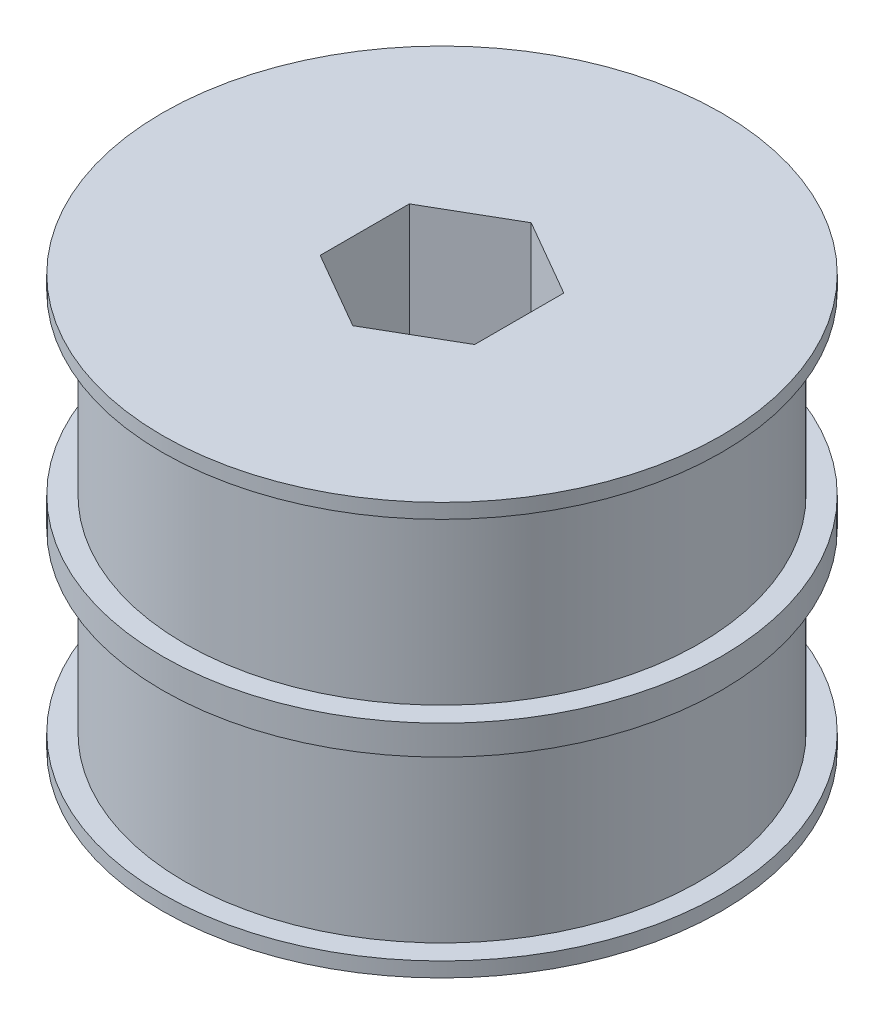
ISO-10303-21;
HEADER;
FILE_DESCRIPTION(('STEP AP214'),'2;1');
FILE_NAME('part.step','',(''),(''),'','','');
FILE_SCHEMA(('AUTOMOTIVE_DESIGN { 1 0 10303 214 1 1 1 1 }'));
ENDSEC;
DATA;
#1=APPLICATION_CONTEXT('core data for automotive mechanical design processes');
#2=APPLICATION_PROTOCOL_DEFINITION('international standard','automotive_design',2000,#1);
#3=PRODUCT_CONTEXT('',#1,'mechanical');
#4=PRODUCT('Part','Part','',(#3));
#5=PRODUCT_RELATED_PRODUCT_CATEGORY('part','',(#4));
#6=PRODUCT_DEFINITION_FORMATION('','',#4);
#7=PRODUCT_DEFINITION_CONTEXT('part definition',#1,'design');
#8=PRODUCT_DEFINITION('design','',#6,#7);
#9=PRODUCT_DEFINITION_SHAPE('','',#8);
#10=(LENGTH_UNIT() NAMED_UNIT(*) SI_UNIT(.MILLI.,.METRE.));
#11=(NAMED_UNIT(*) PLANE_ANGLE_UNIT() SI_UNIT($,.RADIAN.));
#12=(NAMED_UNIT(*) SI_UNIT($,.STERADIAN.) SOLID_ANGLE_UNIT());
#13=UNCERTAINTY_MEASURE_WITH_UNIT(LENGTH_MEASURE(1.E-05),#10,'distance_accuracy_value','');
#14=(GEOMETRIC_REPRESENTATION_CONTEXT(3) GLOBAL_UNCERTAINTY_ASSIGNED_CONTEXT((#13)) GLOBAL_UNIT_ASSIGNED_CONTEXT((#10,
#11,#12)) REPRESENTATION_CONTEXT('',''));
#15=CARTESIAN_POINT('',(0.,0.,0.));
#16=DIRECTION('',(0.,0.,1.));
#17=DIRECTION('',(1.,0.,0.));
#18=AXIS2_PLACEMENT_3D('',#15,#16,#17);
#19=CARTESIAN_POINT('',(0.,17.78,0.));
#20=DIRECTION('',(0.,-1.,0.));
#21=DIRECTION('',(0.,0.,-1.));
#22=AXIS2_PLACEMENT_3D('',#19,#20,#21);
#23=CYLINDRICAL_SURFACE('',#22,24.13);
#24=CARTESIAN_POINT('',(0.,17.78,0.));
#25=DIRECTION('',(0.,1.,0.));
#26=DIRECTION('',(0.,0.,1.));
#27=AXIS2_PLACEMENT_3D('',#24,#25,#26);
#28=CIRCLE('',#27,24.13);
#29=CARTESIAN_POINT('',(0.,17.78,24.13));
#30=VERTEX_POINT('',#29);
#31=EDGE_CURVE('E123',#30,#30,#28,.T.);
#32=ORIENTED_EDGE('',*,*,#31,.F.);
#33=EDGE_LOOP('',(#32));
#34=FACE_BOUND('',#33,.T.);
#35=CARTESIAN_POINT('',(0.,16.51,0.));
#36=DIRECTION('',(0.,-1.,0.));
#37=DIRECTION('',(0.,0.,-1.));
#38=AXIS2_PLACEMENT_3D('',#35,#36,#37);
#39=CIRCLE('',#38,24.13);
#40=CARTESIAN_POINT('',(0.,16.51,-24.13));
#41=VERTEX_POINT('',#40);
#42=EDGE_CURVE('E157',#41,#41,#39,.T.);
#43=ORIENTED_EDGE('',*,*,#42,.F.);
#44=EDGE_LOOP('',(#43));
#45=FACE_BOUND('',#44,.T.);
#46=ADVANCED_FACE('F41',(#34,#45),#23,.T.);
#47=CARTESIAN_POINT('',(3.33375,17.78,-5.77422437973275));
#48=DIRECTION('',(-0.5,0.,0.866025403784439));
#49=DIRECTION('',(0.866025403784439,0.,0.5));
#50=AXIS2_PLACEMENT_3D('',#47,#48,#49);
#51=PLANE('',#50);
#52=DIRECTION('',(-0.866025403784439,0.,-0.5));
#53=VECTOR('',#52,1.);
#54=CARTESIAN_POINT('',(3.33375,-17.78,-5.77422437973275));
#55=LINE('',#54,#53);
#56=CARTESIAN_POINT('',(6.6675,-17.78,-3.84948291982183));
#57=VERTEX_POINT('',#56);
#58=CARTESIAN_POINT('',(0.,-17.78,-7.69896583964366));
#59=VERTEX_POINT('',#58);
#60=EDGE_CURVE('E129',#57,#59,#55,.T.);
#61=ORIENTED_EDGE('',*,*,#60,.F.);
#62=DIRECTION('',(0.,-1.,0.));
#63=VECTOR('',#62,1.);
#64=CARTESIAN_POINT('',(6.6675,17.78,-3.84948291982183));
#65=LINE('',#64,#63);
#66=CARTESIAN_POINT('',(6.6675,17.78,-3.84948291982183));
#67=VERTEX_POINT('',#66);
#68=EDGE_CURVE('E11',#67,#57,#65,.T.);
#69=ORIENTED_EDGE('',*,*,#68,.F.);
#70=DIRECTION('',(-0.866025403784439,0.,-0.5));
#71=VECTOR('',#70,1.);
#72=CARTESIAN_POINT('',(3.33375,17.78,-5.77422437973275));
#73=LINE('',#72,#71);
#74=CARTESIAN_POINT('',(0.,17.78,-7.69896583964366));
#75=VERTEX_POINT('',#74);
#76=EDGE_CURVE('E146',#67,#75,#73,.T.);
#77=ORIENTED_EDGE('',*,*,#76,.T.);
#78=DIRECTION('',(0.,-1.,0.));
#79=VECTOR('',#78,1.);
#80=CARTESIAN_POINT('',(0.,17.78,-7.69896583964366));
#81=LINE('',#80,#79);
#82=EDGE_CURVE('E60',#75,#59,#81,.T.);
#83=ORIENTED_EDGE('',*,*,#82,.T.);
#84=EDGE_LOOP('',(#61,#69,#77,#83));
#85=FACE_BOUND('',#84,.T.);
#86=ADVANCED_FACE('F43',(#85),#51,.T.);
#87=CARTESIAN_POINT('',(6.6675,17.78,0.));
#88=DIRECTION('',(-1.,0.,0.));
#89=DIRECTION('',(0.,0.,1.));
#90=AXIS2_PLACEMENT_3D('',#87,#88,#89);
#91=PLANE('',#90);
#92=DIRECTION('',(0.,0.,-1.));
#93=VECTOR('',#92,1.);
#94=CARTESIAN_POINT('',(6.6675,-17.78,0.));
#95=LINE('',#94,#93);
#96=CARTESIAN_POINT('',(6.6675,-17.78,3.84948291982183));
#97=VERTEX_POINT('',#96);
#98=EDGE_CURVE('E131',#97,#57,#95,.T.);
#99=ORIENTED_EDGE('',*,*,#98,.F.);
#100=DIRECTION('',(0.,-1.,0.));
#101=VECTOR('',#100,1.);
#102=CARTESIAN_POINT('',(6.6675,17.78,3.84948291982183));
#103=LINE('',#102,#101);
#104=CARTESIAN_POINT('',(6.6675,17.78,3.84948291982183));
#105=VERTEX_POINT('',#104);
#106=EDGE_CURVE('E51',#105,#97,#103,.T.);
#107=ORIENTED_EDGE('',*,*,#106,.F.);
#108=DIRECTION('',(0.,0.,-1.));
#109=VECTOR('',#108,1.);
#110=CARTESIAN_POINT('',(6.6675,17.78,0.));
#111=LINE('',#110,#109);
#112=EDGE_CURVE('E239',#105,#67,#111,.T.);
#113=ORIENTED_EDGE('',*,*,#112,.T.);
#114=ORIENTED_EDGE('',*,*,#68,.T.);
#115=EDGE_LOOP('',(#99,#107,#113,#114));
#116=FACE_BOUND('',#115,.T.);
#117=ADVANCED_FACE('F190',(#116),#91,.T.);
#118=CARTESIAN_POINT('',(3.33375,17.78,5.77422437973274));
#119=DIRECTION('',(-0.5,0.,-0.866025403784439));
#120=DIRECTION('',(-0.866025403784439,0.,0.5));
#121=AXIS2_PLACEMENT_3D('',#118,#119,#120);
#122=PLANE('',#121);
#123=DIRECTION('',(0.866025403784439,0.,-0.5));
#124=VECTOR('',#123,1.);
#125=CARTESIAN_POINT('',(3.33375,-17.78,5.77422437973274));
#126=LINE('',#125,#124);
#127=CARTESIAN_POINT('',(0.,-17.78,7.69896583964366));
#128=VERTEX_POINT('',#127);
#129=EDGE_CURVE('E134',#128,#97,#126,.T.);
#130=ORIENTED_EDGE('',*,*,#129,.F.);
#131=DIRECTION('',(0.,-1.,0.));
#132=VECTOR('',#131,1.);
#133=CARTESIAN_POINT('',(0.,17.78,7.69896583964366));
#134=LINE('',#133,#132);
#135=CARTESIAN_POINT('',(0.,17.78,7.69896583964366));
#136=VERTEX_POINT('',#135);
#137=EDGE_CURVE('E107',#136,#128,#134,.T.);
#138=ORIENTED_EDGE('',*,*,#137,.F.);
#139=DIRECTION('',(0.866025403784439,0.,-0.5));
#140=VECTOR('',#139,1.);
#141=CARTESIAN_POINT('',(3.33375,17.78,5.77422437973274));
#142=LINE('',#141,#140);
#143=EDGE_CURVE('E118',#136,#105,#142,.T.);
#144=ORIENTED_EDGE('',*,*,#143,.T.);
#145=ORIENTED_EDGE('',*,*,#106,.T.);
#146=EDGE_LOOP('',(#130,#138,#144,#145));
#147=FACE_BOUND('',#146,.T.);
#148=ADVANCED_FACE('F243',(#147),#122,.T.);
#149=CARTESIAN_POINT('',(-3.33375,17.78,5.77422437973274));
#150=DIRECTION('',(0.5,0.,-0.866025403784439));
#151=DIRECTION('',(-0.866025403784439,0.,-0.5));
#152=AXIS2_PLACEMENT_3D('',#149,#150,#151);
#153=PLANE('',#152);
#154=DIRECTION('',(0.866025403784439,0.,0.5));
#155=VECTOR('',#154,1.);
#156=CARTESIAN_POINT('',(-3.33375,-17.78,5.77422437973274));
#157=LINE('',#156,#155);
#158=CARTESIAN_POINT('',(-6.6675,-17.78,3.84948291982183));
#159=VERTEX_POINT('',#158);
#160=EDGE_CURVE('E103',#159,#128,#157,.T.);
#161=ORIENTED_EDGE('',*,*,#160,.F.);
#162=DIRECTION('',(0.,-1.,0.));
#163=VECTOR('',#162,1.);
#164=CARTESIAN_POINT('',(-6.6675,17.78,3.84948291982183));
#165=LINE('',#164,#163);
#166=CARTESIAN_POINT('',(-6.6675,17.78,3.84948291982183));
#167=VERTEX_POINT('',#166);
#168=EDGE_CURVE('E98',#167,#159,#165,.T.);
#169=ORIENTED_EDGE('',*,*,#168,.F.);
#170=DIRECTION('',(0.866025403784439,0.,0.5));
#171=VECTOR('',#170,1.);
#172=CARTESIAN_POINT('',(-3.33375,17.78,5.77422437973274));
#173=LINE('',#172,#171);
#174=EDGE_CURVE('E101',#167,#136,#173,.T.);
#175=ORIENTED_EDGE('',*,*,#174,.T.);
#176=ORIENTED_EDGE('',*,*,#137,.T.);
#177=EDGE_LOOP('',(#161,#169,#175,#176));
#178=FACE_BOUND('',#177,.T.);
#179=ADVANCED_FACE('F100',(#178),#153,.T.);
#180=CARTESIAN_POINT('',(-6.6675,17.78,0.));
#181=DIRECTION('',(1.,0.,0.));
#182=DIRECTION('',(0.,0.,-1.));
#183=AXIS2_PLACEMENT_3D('',#180,#181,#182);
#184=PLANE('',#183);
#185=DIRECTION('',(0.,0.,1.));
#186=VECTOR('',#185,1.);
#187=CARTESIAN_POINT('',(-6.6675,-17.78,0.));
#188=LINE('',#187,#186);
#189=CARTESIAN_POINT('',(-6.6675,-17.78,-3.84948291982183));
#190=VERTEX_POINT('',#189);
#191=EDGE_CURVE('E138',#190,#159,#188,.T.);
#192=ORIENTED_EDGE('',*,*,#191,.F.);
#193=DIRECTION('',(0.,-1.,0.));
#194=VECTOR('',#193,1.);
#195=CARTESIAN_POINT('',(-6.6675,17.78,-3.84948291982183));
#196=LINE('',#195,#194);
#197=CARTESIAN_POINT('',(-6.6675,17.78,-3.84948291982183));
#198=VERTEX_POINT('',#197);
#199=EDGE_CURVE('E79',#198,#190,#196,.T.);
#200=ORIENTED_EDGE('',*,*,#199,.F.);
#201=DIRECTION('',(0.,0.,1.));
#202=VECTOR('',#201,1.);
#203=CARTESIAN_POINT('',(-6.6675,17.78,0.));
#204=LINE('',#203,#202);
#205=EDGE_CURVE('E115',#198,#167,#204,.T.);
#206=ORIENTED_EDGE('',*,*,#205,.T.);
#207=ORIENTED_EDGE('',*,*,#168,.T.);
#208=EDGE_LOOP('',(#192,#200,#206,#207));
#209=FACE_BOUND('',#208,.T.);
#210=ADVANCED_FACE('F120',(#209),#184,.T.);
#211=CARTESIAN_POINT('',(-3.33375,17.78,-5.77422437973275));
#212=DIRECTION('',(0.5,0.,0.866025403784439));
#213=DIRECTION('',(0.866025403784439,0.,-0.5));
#214=AXIS2_PLACEMENT_3D('',#211,#212,#213);
#215=PLANE('',#214);
#216=DIRECTION('',(-0.866025403784439,0.,0.5));
#217=VECTOR('',#216,1.);
#218=CARTESIAN_POINT('',(-3.33375,-17.78,-5.77422437973275));
#219=LINE('',#218,#217);
#220=EDGE_CURVE('E140',#59,#190,#219,.T.);
#221=ORIENTED_EDGE('',*,*,#220,.F.);
#222=ORIENTED_EDGE('',*,*,#82,.F.);
#223=DIRECTION('',(-0.866025403784439,0.,0.5));
#224=VECTOR('',#223,1.);
#225=CARTESIAN_POINT('',(-3.33375,17.78,-5.77422437973275));
#226=LINE('',#225,#224);
#227=EDGE_CURVE('E121',#75,#198,#226,.T.);
#228=ORIENTED_EDGE('',*,*,#227,.T.);
#229=ORIENTED_EDGE('',*,*,#199,.T.);
#230=EDGE_LOOP('',(#221,#222,#228,#229));
#231=FACE_BOUND('',#230,.T.);
#232=ADVANCED_FACE('F196',(#231),#215,.T.);
#233=CARTESIAN_POINT('',(0.,-16.51,0.));
#234=DIRECTION('',(0.,-1.,0.));
#235=DIRECTION('',(0.,0.,-1.));
#236=AXIS2_PLACEMENT_3D('',#233,#234,#235);
#237=CIRCLE('',#236,24.13);
#238=CARTESIAN_POINT('',(0.,-16.51,-24.13));
#239=VERTEX_POINT('',#238);
#240=EDGE_CURVE('E151',#239,#239,#237,.T.);
#241=ORIENTED_EDGE('',*,*,#240,.T.);
#242=EDGE_LOOP('',(#241));
#243=FACE_BOUND('',#242,.T.);
#244=CARTESIAN_POINT('',(0.,-17.78,0.));
#245=DIRECTION('',(0.,1.,0.));
#246=DIRECTION('',(0.,0.,1.));
#247=AXIS2_PLACEMENT_3D('',#244,#245,#246);
#248=CIRCLE('',#247,24.13);
#249=CARTESIAN_POINT('',(0.,-17.78,24.13));
#250=VERTEX_POINT('',#249);
#251=EDGE_CURVE('E143',#250,#250,#248,.T.);
#252=ORIENTED_EDGE('',*,*,#251,.T.);
#253=EDGE_LOOP('',(#252));
#254=FACE_BOUND('',#253,.T.);
#255=ADVANCED_FACE('F181',(#243,#254),#23,.T.);
#256=CARTESIAN_POINT('',(0.,17.78,0.));
#257=DIRECTION('',(0.,1.,0.));
#258=DIRECTION('',(0.,0.,1.));
#259=AXIS2_PLACEMENT_3D('',#256,#257,#258);
#260=PLANE('',#259);
#261=ORIENTED_EDGE('',*,*,#76,.F.);
#262=ORIENTED_EDGE('',*,*,#112,.F.);
#263=ORIENTED_EDGE('',*,*,#143,.F.);
#264=ORIENTED_EDGE('',*,*,#174,.F.);
#265=ORIENTED_EDGE('',*,*,#205,.F.);
#266=ORIENTED_EDGE('',*,*,#227,.F.);
#267=EDGE_LOOP('',(#261,#262,#263,#264,#265,#266));
#268=FACE_BOUND('',#267,.T.);
#269=ORIENTED_EDGE('',*,*,#31,.T.);
#270=EDGE_LOOP('',(#269));
#271=FACE_BOUND('',#270,.T.);
#272=ADVANCED_FACE('F112',(#268,#271),#260,.T.);
#273=CARTESIAN_POINT('',(0.,-17.78,0.));
#274=DIRECTION('',(0.,1.,0.));
#275=DIRECTION('',(0.,0.,1.));
#276=AXIS2_PLACEMENT_3D('',#273,#274,#275);
#277=PLANE('',#276);
#278=ORIENTED_EDGE('',*,*,#60,.T.);
#279=ORIENTED_EDGE('',*,*,#220,.T.);
#280=ORIENTED_EDGE('',*,*,#191,.T.);
#281=ORIENTED_EDGE('',*,*,#160,.T.);
#282=ORIENTED_EDGE('',*,*,#129,.T.);
#283=ORIENTED_EDGE('',*,*,#98,.T.);
#284=EDGE_LOOP('',(#278,#279,#280,#281,#282,#283));
#285=FACE_BOUND('',#284,.T.);
#286=ORIENTED_EDGE('',*,*,#251,.F.);
#287=EDGE_LOOP('',(#286));
#288=FACE_BOUND('',#287,.T.);
#289=ADVANCED_FACE('F202',(#285,#288),#277,.F.);
#290=CARTESIAN_POINT('',(0.,-1.27,0.));
#291=DIRECTION('',(0.,-1.,0.));
#292=DIRECTION('',(0.,0.,-1.));
#293=AXIS2_PLACEMENT_3D('',#290,#291,#292);
#294=PLANE('',#293);
#295=CARTESIAN_POINT('',(0.,-1.27,0.));
#296=DIRECTION('',(0.,1.,0.));
#297=DIRECTION('',(0.,0.,1.));
#298=AXIS2_PLACEMENT_3D('',#295,#296,#297);
#299=CIRCLE('',#298,22.225);
#300=CARTESIAN_POINT('',(0.,-1.27,22.225));
#301=VERTEX_POINT('',#300);
#302=EDGE_CURVE('E227',#301,#301,#299,.T.);
#303=ORIENTED_EDGE('',*,*,#302,.T.);
#304=EDGE_LOOP('',(#303));
#305=FACE_BOUND('',#304,.T.);
#306=CARTESIAN_POINT('',(0.,-1.27,0.));
#307=DIRECTION('',(0.,-1.,0.));
#308=DIRECTION('',(0.,0.,-1.));
#309=AXIS2_PLACEMENT_3D('',#306,#307,#308);
#310=CIRCLE('',#309,24.13);
#311=CARTESIAN_POINT('',(0.,-1.27,-24.13));
#312=VERTEX_POINT('',#311);
#313=EDGE_CURVE('E154',#312,#312,#310,.T.);
#314=ORIENTED_EDGE('',*,*,#313,.T.);
#315=EDGE_LOOP('',(#314));
#316=FACE_BOUND('',#315,.T.);
#317=ADVANCED_FACE('F209',(#305,#316),#294,.T.);
#318=CARTESIAN_POINT('',(0.,-16.51,0.));
#319=DIRECTION('',(0.,-1.,0.));
#320=DIRECTION('',(0.,0.,-1.));
#321=AXIS2_PLACEMENT_3D('',#318,#319,#320);
#322=PLANE('',#321);
#323=CARTESIAN_POINT('',(0.,-16.51,0.));
#324=DIRECTION('',(0.,1.,0.));
#325=DIRECTION('',(0.,0.,1.));
#326=AXIS2_PLACEMENT_3D('',#323,#324,#325);
#327=CIRCLE('',#326,22.225);
#328=CARTESIAN_POINT('',(0.,-16.51,22.225));
#329=VERTEX_POINT('',#328);
#330=EDGE_CURVE('E230',#329,#329,#327,.T.);
#331=ORIENTED_EDGE('',*,*,#330,.F.);
#332=EDGE_LOOP('',(#331));
#333=FACE_BOUND('',#332,.T.);
#334=ORIENTED_EDGE('',*,*,#240,.F.);
#335=EDGE_LOOP('',(#334));
#336=FACE_BOUND('',#335,.T.);
#337=ADVANCED_FACE('F214',(#333,#336),#322,.F.);
#338=CARTESIAN_POINT('',(0.,17.78,0.));
#339=DIRECTION('',(0.,1.,0.));
#340=DIRECTION('',(0.,0.,1.));
#341=AXIS2_PLACEMENT_3D('',#338,#339,#340);
#342=CYLINDRICAL_SURFACE('',#341,22.225);
#343=ORIENTED_EDGE('',*,*,#302,.F.);
#344=EDGE_LOOP('',(#343));
#345=FACE_BOUND('',#344,.T.);
#346=ORIENTED_EDGE('',*,*,#330,.T.);
#347=EDGE_LOOP('',(#346));
#348=FACE_BOUND('',#347,.T.);
#349=ADVANCED_FACE('F179',(#345,#348),#342,.T.);
#350=CARTESIAN_POINT('',(0.,1.27,0.));
#351=DIRECTION('',(0.,-1.,0.));
#352=DIRECTION('',(0.,0.,-1.));
#353=AXIS2_PLACEMENT_3D('',#350,#351,#352);
#354=CIRCLE('',#353,24.13);
#355=CARTESIAN_POINT('',(0.,1.27,-24.13));
#356=VERTEX_POINT('',#355);
#357=EDGE_CURVE('E45',#356,#356,#354,.T.);
#358=ORIENTED_EDGE('',*,*,#357,.T.);
#359=EDGE_LOOP('',(#358));
#360=FACE_BOUND('',#359,.T.);
#361=ORIENTED_EDGE('',*,*,#313,.F.);
#362=EDGE_LOOP('',(#361));
#363=FACE_BOUND('',#362,.T.);
#364=ADVANCED_FACE('F164',(#360,#363),#23,.T.);
#365=CARTESIAN_POINT('',(0.,1.27,0.));
#366=DIRECTION('',(0.,-1.,0.));
#367=DIRECTION('',(0.,0.,-1.));
#368=AXIS2_PLACEMENT_3D('',#365,#366,#367);
#369=PLANE('',#368);
#370=CARTESIAN_POINT('',(0.,1.27,0.));
#371=DIRECTION('',(0.,1.,0.));
#372=DIRECTION('',(0.,0.,1.));
#373=AXIS2_PLACEMENT_3D('',#370,#371,#372);
#374=CIRCLE('',#373,22.225);
#375=CARTESIAN_POINT('',(0.,1.27,22.225));
#376=VERTEX_POINT('',#375);
#377=EDGE_CURVE('E155',#376,#376,#374,.T.);
#378=ORIENTED_EDGE('',*,*,#377,.F.);
#379=EDGE_LOOP('',(#378));
#380=FACE_BOUND('',#379,.T.);
#381=ORIENTED_EDGE('',*,*,#357,.F.);
#382=EDGE_LOOP('',(#381));
#383=FACE_BOUND('',#382,.T.);
#384=ADVANCED_FACE('F167',(#380,#383),#369,.F.);
#385=CARTESIAN_POINT('',(0.,16.51,0.));
#386=DIRECTION('',(0.,-1.,0.));
#387=DIRECTION('',(0.,0.,-1.));
#388=AXIS2_PLACEMENT_3D('',#385,#386,#387);
#389=PLANE('',#388);
#390=CARTESIAN_POINT('',(0.,16.51,0.));
#391=DIRECTION('',(0.,1.,0.));
#392=DIRECTION('',(0.,0.,1.));
#393=AXIS2_PLACEMENT_3D('',#390,#391,#392);
#394=CIRCLE('',#393,22.225);
#395=CARTESIAN_POINT('',(0.,16.51,22.225));
#396=VERTEX_POINT('',#395);
#397=EDGE_CURVE('E231',#396,#396,#394,.T.);
#398=ORIENTED_EDGE('',*,*,#397,.T.);
#399=EDGE_LOOP('',(#398));
#400=FACE_BOUND('',#399,.T.);
#401=ORIENTED_EDGE('',*,*,#42,.T.);
#402=EDGE_LOOP('',(#401));
#403=FACE_BOUND('',#402,.T.);
#404=ADVANCED_FACE('F169',(#400,#403),#389,.T.);
#405=CARTESIAN_POINT('',(0.,17.78,0.));
#406=DIRECTION('',(0.,1.,0.));
#407=DIRECTION('',(0.,0.,1.));
#408=AXIS2_PLACEMENT_3D('',#405,#406,#407);
#409=CYLINDRICAL_SURFACE('',#408,22.225);
#410=ORIENTED_EDGE('',*,*,#397,.F.);
#411=EDGE_LOOP('',(#410));
#412=FACE_BOUND('',#411,.T.);
#413=ORIENTED_EDGE('',*,*,#377,.T.);
#414=EDGE_LOOP('',(#413));
#415=FACE_BOUND('',#414,.T.);
#416=ADVANCED_FACE('F176',(#412,#415),#409,.T.);
#417=CLOSED_SHELL('',(#46,#86,#117,#148,#179,#210,#232,#255,#272,#289,#317,#337,#349,#364,#384,
#404,#416));
#418=MANIFOLD_SOLID_BREP('B2',#417);
#419=ADVANCED_BREP_SHAPE_REPRESENTATION('',(#18,#418),#14);
#420=SHAPE_DEFINITION_REPRESENTATION(#9,#419);
ENDSEC;
END-ISO-10303-21;
